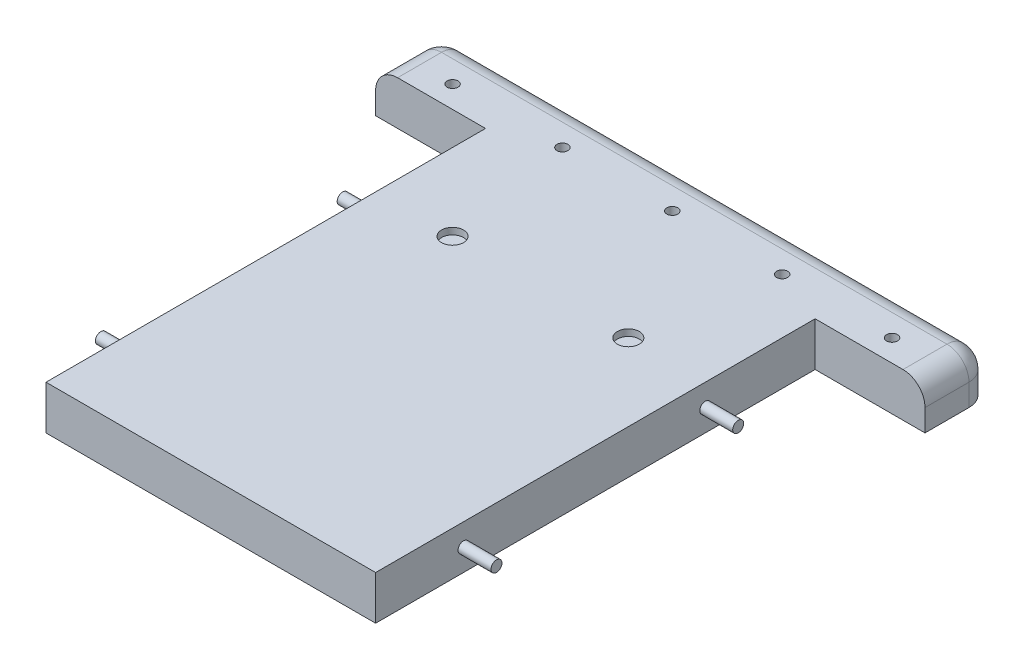
ISO-10303-21;
HEADER;
FILE_DESCRIPTION(('STEP AP214'),'2;1');
FILE_NAME('part.step','',(''),(''),'','','');
FILE_SCHEMA(('AUTOMOTIVE_DESIGN { 1 0 10303 214 1 1 1 1 }'));
ENDSEC;
DATA;
#1=APPLICATION_CONTEXT('core data for automotive mechanical design processes');
#2=APPLICATION_PROTOCOL_DEFINITION('international standard','automotive_design',2000,#1);
#3=PRODUCT_CONTEXT('',#1,'mechanical');
#4=PRODUCT('Part','Part','',(#3));
#5=PRODUCT_RELATED_PRODUCT_CATEGORY('part','',(#4));
#6=PRODUCT_DEFINITION_FORMATION('','',#4);
#7=PRODUCT_DEFINITION_CONTEXT('part definition',#1,'design');
#8=PRODUCT_DEFINITION('design','',#6,#7);
#9=PRODUCT_DEFINITION_SHAPE('','',#8);
#10=(LENGTH_UNIT() NAMED_UNIT(*) SI_UNIT(.MILLI.,.METRE.));
#11=(NAMED_UNIT(*) PLANE_ANGLE_UNIT() SI_UNIT($,.RADIAN.));
#12=(NAMED_UNIT(*) SI_UNIT($,.STERADIAN.) SOLID_ANGLE_UNIT());
#13=UNCERTAINTY_MEASURE_WITH_UNIT(LENGTH_MEASURE(1.E-05),#10,'distance_accuracy_value','');
#14=(GEOMETRIC_REPRESENTATION_CONTEXT(3) GLOBAL_UNCERTAINTY_ASSIGNED_CONTEXT((#13)) GLOBAL_UNIT_ASSIGNED_CONTEXT((#10,
#11,#12)) REPRESENTATION_CONTEXT('',''));
#15=CARTESIAN_POINT('',(0.,0.,0.));
#16=DIRECTION('',(0.,0.,1.));
#17=DIRECTION('',(1.,0.,0.));
#18=AXIS2_PLACEMENT_3D('',#15,#16,#17);
#19=CARTESIAN_POINT('',(-75.,20.,-100.));
#20=DIRECTION('',(1.,0.,0.));
#21=DIRECTION('',(0.,0.,-1.));
#22=AXIS2_PLACEMENT_3D('',#19,#20,#21);
#23=PLANE('',#22);
#24=CARTESIAN_POINT('',(-75.,10.,-50.));
#25=DIRECTION('',(1.,0.,0.));
#26=DIRECTION('',(0.,0.,-1.));
#27=AXIS2_PLACEMENT_3D('',#24,#25,#26);
#28=CIRCLE('',#27,2.49999999999999);
#29=CARTESIAN_POINT('',(-75.,10.,-52.5));
#30=VERTEX_POINT('',#29);
#31=EDGE_CURVE('E213',#30,#30,#28,.T.);
#32=ORIENTED_EDGE('',*,*,#31,.T.);
#33=EDGE_LOOP('',(#32));
#34=FACE_BOUND('',#33,.T.);
#35=CARTESIAN_POINT('',(-75.,10.,60.));
#36=DIRECTION('',(1.,0.,0.));
#37=DIRECTION('',(0.,0.,-1.));
#38=AXIS2_PLACEMENT_3D('',#35,#36,#37);
#39=CIRCLE('',#38,2.49999999999999);
#40=CARTESIAN_POINT('',(-75.,10.,57.5));
#41=VERTEX_POINT('',#40);
#42=EDGE_CURVE('E200',#41,#41,#39,.T.);
#43=ORIENTED_EDGE('',*,*,#42,.T.);
#44=EDGE_LOOP('',(#43));
#45=FACE_BOUND('',#44,.T.);
#46=DIRECTION('',(0.,0.,1.));
#47=VECTOR('',#46,1.);
#48=CARTESIAN_POINT('',(-75.,0.,-100.));
#49=LINE('',#48,#47);
#50=CARTESIAN_POINT('',(-75.,0.,-100.));
#51=VERTEX_POINT('',#50);
#52=CARTESIAN_POINT('',(-75.,0.,100.));
#53=VERTEX_POINT('',#52);
#54=EDGE_CURVE('E150',#51,#53,#49,.T.);
#55=ORIENTED_EDGE('',*,*,#54,.T.);
#56=DIRECTION('',(0.,-1.,0.));
#57=VECTOR('',#56,1.);
#58=CARTESIAN_POINT('',(-75.,20.,100.));
#59=LINE('',#58,#57);
#60=CARTESIAN_POINT('',(-75.,20.,100.));
#61=VERTEX_POINT('',#60);
#62=EDGE_CURVE('E130',#61,#53,#59,.T.);
#63=ORIENTED_EDGE('',*,*,#62,.F.);
#64=DIRECTION('',(0.,0.,1.));
#65=VECTOR('',#64,1.);
#66=CARTESIAN_POINT('',(-75.,20.,-100.));
#67=LINE('',#66,#65);
#68=CARTESIAN_POINT('',(-75.,20.,-100.));
#69=VERTEX_POINT('',#68);
#70=EDGE_CURVE('E137',#69,#61,#67,.T.);
#71=ORIENTED_EDGE('',*,*,#70,.F.);
#72=DIRECTION('',(0.,-1.,0.));
#73=VECTOR('',#72,1.);
#74=CARTESIAN_POINT('',(-75.,20.,-100.));
#75=LINE('',#74,#73);
#76=EDGE_CURVE('E290',#69,#51,#75,.T.);
#77=ORIENTED_EDGE('',*,*,#76,.T.);
#78=EDGE_LOOP('',(#55,#63,#71,#77));
#79=FACE_BOUND('',#78,.T.);
#80=ADVANCED_FACE('F35',(#34,#45,#79),#23,.F.);
#81=CARTESIAN_POINT('',(-75.,20.,100.));
#82=DIRECTION('',(0.,0.,-1.));
#83=DIRECTION('',(-1.,0.,0.));
#84=AXIS2_PLACEMENT_3D('',#81,#82,#83);
#85=PLANE('',#84);
#86=DIRECTION('',(1.,0.,0.));
#87=VECTOR('',#86,1.);
#88=CARTESIAN_POINT('',(-75.,0.,100.));
#89=LINE('',#88,#87);
#90=CARTESIAN_POINT('',(75.,0.,100.));
#91=VERTEX_POINT('',#90);
#92=EDGE_CURVE('E292',#53,#91,#89,.T.);
#93=ORIENTED_EDGE('',*,*,#92,.T.);
#94=DIRECTION('',(0.,-1.,0.));
#95=VECTOR('',#94,1.);
#96=CARTESIAN_POINT('',(75.,20.,100.));
#97=LINE('',#96,#95);
#98=CARTESIAN_POINT('',(75.,20.,100.));
#99=VERTEX_POINT('',#98);
#100=EDGE_CURVE('E133',#99,#91,#97,.T.);
#101=ORIENTED_EDGE('',*,*,#100,.F.);
#102=DIRECTION('',(1.,0.,0.));
#103=VECTOR('',#102,1.);
#104=CARTESIAN_POINT('',(-75.,20.,100.));
#105=LINE('',#104,#103);
#106=EDGE_CURVE('E126',#61,#99,#105,.T.);
#107=ORIENTED_EDGE('',*,*,#106,.F.);
#108=ORIENTED_EDGE('',*,*,#62,.T.);
#109=EDGE_LOOP('',(#93,#101,#107,#108));
#110=FACE_BOUND('',#109,.T.);
#111=ADVANCED_FACE('F128',(#110),#85,.F.);
#112=CARTESIAN_POINT('',(75.,20.,100.));
#113=DIRECTION('',(-1.,0.,0.));
#114=DIRECTION('',(0.,0.,1.));
#115=AXIS2_PLACEMENT_3D('',#112,#113,#114);
#116=PLANE('',#115);
#117=CARTESIAN_POINT('',(75.,10.,-50.));
#118=DIRECTION('',(-1.,0.,0.));
#119=DIRECTION('',(0.,0.,1.));
#120=AXIS2_PLACEMENT_3D('',#117,#118,#119);
#121=CIRCLE('',#120,2.49999999999999);
#122=CARTESIAN_POINT('',(75.,10.,-47.5));
#123=VERTEX_POINT('',#122);
#124=EDGE_CURVE('E39',#123,#123,#121,.T.);
#125=ORIENTED_EDGE('',*,*,#124,.T.);
#126=EDGE_LOOP('',(#125));
#127=FACE_BOUND('',#126,.T.);
#128=CARTESIAN_POINT('',(75.,10.,60.));
#129=DIRECTION('',(-1.,0.,0.));
#130=DIRECTION('',(0.,0.,1.));
#131=AXIS2_PLACEMENT_3D('',#128,#129,#130);
#132=CIRCLE('',#131,2.49999999999999);
#133=CARTESIAN_POINT('',(75.,10.,62.5));
#134=VERTEX_POINT('',#133);
#135=EDGE_CURVE('E198',#134,#134,#132,.T.);
#136=ORIENTED_EDGE('',*,*,#135,.T.);
#137=EDGE_LOOP('',(#136));
#138=FACE_BOUND('',#137,.T.);
#139=DIRECTION('',(0.,0.,-1.));
#140=VECTOR('',#139,1.);
#141=CARTESIAN_POINT('',(75.,0.,100.));
#142=LINE('',#141,#140);
#143=CARTESIAN_POINT('',(75.,0.,-100.));
#144=VERTEX_POINT('',#143);
#145=EDGE_CURVE('E294',#91,#144,#142,.T.);
#146=ORIENTED_EDGE('',*,*,#145,.T.);
#147=DIRECTION('',(0.,-1.,0.));
#148=VECTOR('',#147,1.);
#149=CARTESIAN_POINT('',(75.,20.,-100.));
#150=LINE('',#149,#148);
#151=CARTESIAN_POINT('',(75.,20.,-100.));
#152=VERTEX_POINT('',#151);
#153=EDGE_CURVE('E155',#152,#144,#150,.T.);
#154=ORIENTED_EDGE('',*,*,#153,.F.);
#155=DIRECTION('',(0.,0.,-1.));
#156=VECTOR('',#155,1.);
#157=CARTESIAN_POINT('',(75.,20.,100.));
#158=LINE('',#157,#156);
#159=EDGE_CURVE('E136',#99,#152,#158,.T.);
#160=ORIENTED_EDGE('',*,*,#159,.F.);
#161=ORIENTED_EDGE('',*,*,#100,.T.);
#162=EDGE_LOOP('',(#146,#154,#160,#161));
#163=FACE_BOUND('',#162,.T.);
#164=ADVANCED_FACE('F344',(#127,#138,#163),#116,.F.);
#165=CARTESIAN_POINT('',(75.,20.,-100.));
#166=DIRECTION('',(0.,0.,-1.));
#167=DIRECTION('',(-1.,0.,0.));
#168=AXIS2_PLACEMENT_3D('',#165,#166,#167);
#169=PLANE('',#168);
#170=DIRECTION('',(0.,-1.,0.));
#171=VECTOR('',#170,1.);
#172=CARTESIAN_POINT('',(125.,20.,-100.));
#173=LINE('',#172,#171);
#174=CARTESIAN_POINT('',(125.,10.,-100.));
#175=VERTEX_POINT('',#174);
#176=CARTESIAN_POINT('',(125.,0.,-100.));
#177=VERTEX_POINT('',#176);
#178=EDGE_CURVE('E312',#175,#177,#173,.T.);
#179=ORIENTED_EDGE('',*,*,#178,.F.);
#180=CARTESIAN_POINT('',(115.,10.,-100.));
#181=DIRECTION('',(0.,0.,-1.));
#182=DIRECTION('',(-1.,0.,0.));
#183=AXIS2_PLACEMENT_3D('',#180,#181,#182);
#184=CIRCLE('',#183,10.);
#185=CARTESIAN_POINT('',(115.,20.,-100.));
#186=VERTEX_POINT('',#185);
#187=EDGE_CURVE('E178',#175,#186,#184,.F.);
#188=ORIENTED_EDGE('',*,*,#187,.T.);
#189=DIRECTION('',(1.,0.,0.));
#190=VECTOR('',#189,1.);
#191=CARTESIAN_POINT('',(75.,20.,-100.));
#192=LINE('',#191,#190);
#193=EDGE_CURVE('E287',#152,#186,#192,.T.);
#194=ORIENTED_EDGE('',*,*,#193,.F.);
#195=ORIENTED_EDGE('',*,*,#153,.T.);
#196=DIRECTION('',(1.,0.,0.));
#197=VECTOR('',#196,1.);
#198=CARTESIAN_POINT('',(75.,0.,-100.));
#199=LINE('',#198,#197);
#200=EDGE_CURVE('E296',#144,#177,#199,.T.);
#201=ORIENTED_EDGE('',*,*,#200,.T.);
#202=EDGE_LOOP('',(#179,#188,#194,#195,#201));
#203=FACE_BOUND('',#202,.T.);
#204=ADVANCED_FACE('F319',(#203),#169,.F.);
#205=CARTESIAN_POINT('',(125.,20.,-100.));
#206=DIRECTION('',(-1.,0.,0.));
#207=DIRECTION('',(0.,0.,1.));
#208=AXIS2_PLACEMENT_3D('',#205,#206,#207);
#209=PLANE('',#208);
#210=DIRECTION('',(0.,-1.,0.));
#211=VECTOR('',#210,1.);
#212=CARTESIAN_POINT('',(125.,20.,-120.));
#213=LINE('',#212,#211);
#214=CARTESIAN_POINT('',(125.,0.,-120.));
#215=VERTEX_POINT('',#214);
#216=CARTESIAN_POINT('',(125.,10.,-120.));
#217=VERTEX_POINT('',#216);
#218=EDGE_CURVE('E164',#215,#217,#213,.F.);
#219=ORIENTED_EDGE('',*,*,#218,.T.);
#220=DIRECTION('',(0.,0.,-1.));
#221=VECTOR('',#220,1.);
#222=CARTESIAN_POINT('',(125.,10.,-100.));
#223=LINE('',#222,#221);
#224=EDGE_CURVE('E176',#217,#175,#223,.F.);
#225=ORIENTED_EDGE('',*,*,#224,.T.);
#226=ORIENTED_EDGE('',*,*,#178,.T.);
#227=DIRECTION('',(0.,0.,-1.));
#228=VECTOR('',#227,1.);
#229=CARTESIAN_POINT('',(125.,0.,-100.));
#230=LINE('',#229,#228);
#231=EDGE_CURVE('E299',#177,#215,#230,.T.);
#232=ORIENTED_EDGE('',*,*,#231,.T.);
#233=EDGE_LOOP('',(#219,#225,#226,#232));
#234=FACE_BOUND('',#233,.T.);
#235=ADVANCED_FACE('F329',(#234),#209,.F.);
#236=CARTESIAN_POINT('',(125.,20.,-130.));
#237=DIRECTION('',(0.,0.,1.));
#238=DIRECTION('',(1.,0.,0.));
#239=AXIS2_PLACEMENT_3D('',#236,#237,#238);
#240=PLANE('',#239);
#241=DIRECTION('',(0.,-1.,0.));
#242=VECTOR('',#241,1.);
#243=CARTESIAN_POINT('',(-115.,20.,-130.));
#244=LINE('',#243,#242);
#245=CARTESIAN_POINT('',(-115.,0.,-130.));
#246=VERTEX_POINT('',#245);
#247=CARTESIAN_POINT('',(-115.,10.,-130.));
#248=VERTEX_POINT('',#247);
#249=EDGE_CURVE('E151',#246,#248,#244,.F.);
#250=ORIENTED_EDGE('',*,*,#249,.T.);
#251=DIRECTION('',(-1.,0.,0.));
#252=VECTOR('',#251,1.);
#253=CARTESIAN_POINT('',(115.,10.,-130.));
#254=LINE('',#253,#252);
#255=CARTESIAN_POINT('',(115.,10.,-130.));
#256=VERTEX_POINT('',#255);
#257=EDGE_CURVE('E11',#248,#256,#254,.F.);
#258=ORIENTED_EDGE('',*,*,#257,.T.);
#259=DIRECTION('',(0.,-1.,0.));
#260=VECTOR('',#259,1.);
#261=CARTESIAN_POINT('',(115.,20.,-130.));
#262=LINE('',#261,#260);
#263=CARTESIAN_POINT('',(115.,0.,-130.));
#264=VERTEX_POINT('',#263);
#265=EDGE_CURVE('E153',#256,#264,#262,.T.);
#266=ORIENTED_EDGE('',*,*,#265,.T.);
#267=DIRECTION('',(-1.,0.,0.));
#268=VECTOR('',#267,1.);
#269=CARTESIAN_POINT('',(125.,0.,-130.));
#270=LINE('',#269,#268);
#271=EDGE_CURVE('E302',#264,#246,#270,.T.);
#272=ORIENTED_EDGE('',*,*,#271,.T.);
#273=EDGE_LOOP('',(#250,#258,#266,#272));
#274=FACE_BOUND('',#273,.T.);
#275=ADVANCED_FACE('F388',(#274),#240,.F.);
#276=CARTESIAN_POINT('',(-125.,20.,-130.));
#277=DIRECTION('',(1.,0.,0.));
#278=DIRECTION('',(0.,0.,-1.));
#279=AXIS2_PLACEMENT_3D('',#276,#277,#278);
#280=PLANE('',#279);
#281=DIRECTION('',(0.,-1.,0.));
#282=VECTOR('',#281,1.);
#283=CARTESIAN_POINT('',(-125.,20.,-100.));
#284=LINE('',#283,#282);
#285=CARTESIAN_POINT('',(-125.,10.,-100.));
#286=VERTEX_POINT('',#285);
#287=CARTESIAN_POINT('',(-125.,0.,-100.));
#288=VERTEX_POINT('',#287);
#289=EDGE_CURVE('E310',#286,#288,#284,.T.);
#290=ORIENTED_EDGE('',*,*,#289,.F.);
#291=DIRECTION('',(0.,0.,1.));
#292=VECTOR('',#291,1.);
#293=CARTESIAN_POINT('',(-125.,10.,-120.));
#294=LINE('',#293,#292);
#295=CARTESIAN_POINT('',(-125.,10.,-120.));
#296=VERTEX_POINT('',#295);
#297=EDGE_CURVE('E59',#286,#296,#294,.F.);
#298=ORIENTED_EDGE('',*,*,#297,.T.);
#299=DIRECTION('',(0.,-1.,0.));
#300=VECTOR('',#299,1.);
#301=CARTESIAN_POINT('',(-125.,20.,-120.));
#302=LINE('',#301,#300);
#303=CARTESIAN_POINT('',(-125.,0.,-120.));
#304=VERTEX_POINT('',#303);
#305=EDGE_CURVE('E167',#296,#304,#302,.T.);
#306=ORIENTED_EDGE('',*,*,#305,.T.);
#307=DIRECTION('',(0.,0.,1.));
#308=VECTOR('',#307,1.);
#309=CARTESIAN_POINT('',(-125.,0.,-130.));
#310=LINE('',#309,#308);
#311=EDGE_CURVE('E305',#304,#288,#310,.T.);
#312=ORIENTED_EDGE('',*,*,#311,.T.);
#313=EDGE_LOOP('',(#290,#298,#306,#312));
#314=FACE_BOUND('',#313,.T.);
#315=ADVANCED_FACE('F392',(#314),#280,.F.);
#316=CARTESIAN_POINT('',(-125.,20.,-100.));
#317=DIRECTION('',(0.,0.,-1.));
#318=DIRECTION('',(-1.,0.,0.));
#319=AXIS2_PLACEMENT_3D('',#316,#317,#318);
#320=PLANE('',#319);
#321=DIRECTION('',(1.,0.,0.));
#322=VECTOR('',#321,1.);
#323=CARTESIAN_POINT('',(-125.,20.,-100.));
#324=LINE('',#323,#322);
#325=CARTESIAN_POINT('',(-115.,20.,-100.));
#326=VERTEX_POINT('',#325);
#327=EDGE_CURVE('E143',#326,#69,#324,.T.);
#328=ORIENTED_EDGE('',*,*,#327,.F.);
#329=CARTESIAN_POINT('',(-115.,10.,-100.));
#330=DIRECTION('',(0.,0.,-1.));
#331=DIRECTION('',(-1.,0.,0.));
#332=AXIS2_PLACEMENT_3D('',#329,#330,#331);
#333=CIRCLE('',#332,10.);
#334=EDGE_CURVE('E182',#326,#286,#333,.F.);
#335=ORIENTED_EDGE('',*,*,#334,.T.);
#336=ORIENTED_EDGE('',*,*,#289,.T.);
#337=DIRECTION('',(1.,0.,0.));
#338=VECTOR('',#337,1.);
#339=CARTESIAN_POINT('',(-125.,0.,-100.));
#340=LINE('',#339,#338);
#341=EDGE_CURVE('E147',#288,#51,#340,.T.);
#342=ORIENTED_EDGE('',*,*,#341,.T.);
#343=ORIENTED_EDGE('',*,*,#76,.F.);
#344=EDGE_LOOP('',(#328,#335,#336,#342,#343));
#345=FACE_BOUND('',#344,.T.);
#346=ADVANCED_FACE('F396',(#345),#320,.F.);
#347=CARTESIAN_POINT('',(0.,20.,0.));
#348=DIRECTION('',(0.,1.,0.));
#349=DIRECTION('',(0.,0.,1.));
#350=AXIS2_PLACEMENT_3D('',#347,#348,#349);
#351=PLANE('',#350);
#352=CARTESIAN_POINT('',(-40.,20.,-50.));
#353=DIRECTION('',(0.,1.,0.));
#354=DIRECTION('',(0.,0.,1.));
#355=AXIS2_PLACEMENT_3D('',#352,#353,#354);
#356=CIRCLE('',#355,5.);
#357=CARTESIAN_POINT('',(-40.,20.,-45.));
#358=VERTEX_POINT('',#357);
#359=EDGE_CURVE('E221',#358,#358,#356,.T.);
#360=ORIENTED_EDGE('',*,*,#359,.F.);
#361=EDGE_LOOP('',(#360));
#362=FACE_BOUND('',#361,.T.);
#363=CARTESIAN_POINT('',(40.,20.,-50.));
#364=DIRECTION('',(0.,1.,0.));
#365=DIRECTION('',(0.,0.,-1.));
#366=AXIS2_PLACEMENT_3D('',#363,#364,#365);
#367=CIRCLE('',#366,5.);
#368=CARTESIAN_POINT('',(40.,20.,-55.));
#369=VERTEX_POINT('',#368);
#370=EDGE_CURVE('E205',#369,#369,#367,.T.);
#371=ORIENTED_EDGE('',*,*,#370,.F.);
#372=EDGE_LOOP('',(#371));
#373=FACE_BOUND('',#372,.T.);
#374=CARTESIAN_POINT('',(-100.,20.,-110.));
#375=DIRECTION('',(0.,1.,0.));
#376=DIRECTION('',(0.,0.,-1.));
#377=AXIS2_PLACEMENT_3D('',#374,#375,#376);
#378=CIRCLE('',#377,2.50000000000001);
#379=CARTESIAN_POINT('',(-100.,20.,-112.5));
#380=VERTEX_POINT('',#379);
#381=EDGE_CURVE('E220',#380,#380,#378,.T.);
#382=ORIENTED_EDGE('',*,*,#381,.F.);
#383=EDGE_LOOP('',(#382));
#384=FACE_BOUND('',#383,.T.);
#385=CARTESIAN_POINT('',(-50.,20.,-110.));
#386=DIRECTION('',(0.,1.,0.));
#387=DIRECTION('',(0.,0.,-1.));
#388=AXIS2_PLACEMENT_3D('',#385,#386,#387);
#389=CIRCLE('',#388,2.5);
#390=CARTESIAN_POINT('',(-50.,20.,-112.5));
#391=VERTEX_POINT('',#390);
#392=EDGE_CURVE('E245',#391,#391,#389,.T.);
#393=ORIENTED_EDGE('',*,*,#392,.F.);
#394=EDGE_LOOP('',(#393));
#395=FACE_BOUND('',#394,.T.);
#396=CARTESIAN_POINT('',(100.,20.,-110.));
#397=DIRECTION('',(0.,1.,0.));
#398=DIRECTION('',(0.,0.,1.));
#399=AXIS2_PLACEMENT_3D('',#396,#397,#398);
#400=CIRCLE('',#399,2.50000000000001);
#401=CARTESIAN_POINT('',(100.,20.,-107.5));
#402=VERTEX_POINT('',#401);
#403=EDGE_CURVE('E239',#402,#402,#400,.T.);
#404=ORIENTED_EDGE('',*,*,#403,.F.);
#405=EDGE_LOOP('',(#404));
#406=FACE_BOUND('',#405,.T.);
#407=CARTESIAN_POINT('',(50.,20.,-110.));
#408=DIRECTION('',(0.,1.,0.));
#409=DIRECTION('',(0.,0.,1.));
#410=AXIS2_PLACEMENT_3D('',#407,#408,#409);
#411=CIRCLE('',#410,2.5);
#412=CARTESIAN_POINT('',(50.,20.,-107.5));
#413=VERTEX_POINT('',#412);
#414=EDGE_CURVE('E233',#413,#413,#411,.T.);
#415=ORIENTED_EDGE('',*,*,#414,.F.);
#416=EDGE_LOOP('',(#415));
#417=FACE_BOUND('',#416,.T.);
#418=CARTESIAN_POINT('',(0.,20.,-110.));
#419=DIRECTION('',(0.,1.,0.));
#420=DIRECTION('',(0.,0.,1.));
#421=AXIS2_PLACEMENT_3D('',#418,#419,#420);
#422=CIRCLE('',#421,2.5);
#423=CARTESIAN_POINT('',(0.,20.,-107.5));
#424=VERTEX_POINT('',#423);
#425=EDGE_CURVE('E232',#424,#424,#422,.T.);
#426=ORIENTED_EDGE('',*,*,#425,.F.);
#427=EDGE_LOOP('',(#426));
#428=FACE_BOUND('',#427,.T.);
#429=ORIENTED_EDGE('',*,*,#193,.T.);
#430=DIRECTION('',(0.,0.,-1.));
#431=VECTOR('',#430,1.);
#432=CARTESIAN_POINT('',(115.,20.,-120.));
#433=LINE('',#432,#431);
#434=CARTESIAN_POINT('',(115.,20.,-120.));
#435=VERTEX_POINT('',#434);
#436=EDGE_CURVE('E173',#186,#435,#433,.T.);
#437=ORIENTED_EDGE('',*,*,#436,.T.);
#438=DIRECTION('',(-1.,0.,0.));
#439=VECTOR('',#438,1.);
#440=CARTESIAN_POINT('',(-115.,20.,-120.));
#441=LINE('',#440,#439);
#442=CARTESIAN_POINT('',(-115.,20.,-120.));
#443=VERTEX_POINT('',#442);
#444=EDGE_CURVE('E169',#435,#443,#441,.T.);
#445=ORIENTED_EDGE('',*,*,#444,.T.);
#446=DIRECTION('',(0.,0.,1.));
#447=VECTOR('',#446,1.);
#448=CARTESIAN_POINT('',(-115.,20.,-100.));
#449=LINE('',#448,#447);
#450=EDGE_CURVE('E171',#443,#326,#449,.T.);
#451=ORIENTED_EDGE('',*,*,#450,.T.);
#452=ORIENTED_EDGE('',*,*,#327,.T.);
#453=ORIENTED_EDGE('',*,*,#70,.T.);
#454=ORIENTED_EDGE('',*,*,#106,.T.);
#455=ORIENTED_EDGE('',*,*,#159,.T.);
#456=EDGE_LOOP('',(#429,#437,#445,#451,#452,#453,#454,#455));
#457=FACE_BOUND('',#456,.T.);
#458=ADVANCED_FACE('F141',(#362,#373,#384,#395,#406,#417,#428,#457),#351,.T.);
#459=CARTESIAN_POINT('',(0.,0.,0.));
#460=DIRECTION('',(0.,1.,0.));
#461=DIRECTION('',(0.,0.,1.));
#462=AXIS2_PLACEMENT_3D('',#459,#460,#461);
#463=PLANE('',#462);
#464=CARTESIAN_POINT('',(-100.,0.,-115.));
#465=DIRECTION('',(0.,-1.,0.));
#466=DIRECTION('',(0.,0.,-1.));
#467=AXIS2_PLACEMENT_3D('',#464,#465,#466);
#468=CIRCLE('',#467,2.5);
#469=CARTESIAN_POINT('',(-100.,0.,-117.5));
#470=VERTEX_POINT('',#469);
#471=EDGE_CURVE('E260',#470,#470,#468,.T.);
#472=ORIENTED_EDGE('',*,*,#471,.F.);
#473=EDGE_LOOP('',(#472));
#474=FACE_BOUND('',#473,.T.);
#475=CARTESIAN_POINT('',(-50.,0.,-115.));
#476=DIRECTION('',(0.,-1.,0.));
#477=DIRECTION('',(0.,0.,-1.));
#478=AXIS2_PLACEMENT_3D('',#475,#476,#477);
#479=CIRCLE('',#478,2.5);
#480=CARTESIAN_POINT('',(-50.,0.,-117.5));
#481=VERTEX_POINT('',#480);
#482=EDGE_CURVE('E266',#481,#481,#479,.T.);
#483=ORIENTED_EDGE('',*,*,#482,.F.);
#484=EDGE_LOOP('',(#483));
#485=FACE_BOUND('',#484,.T.);
#486=CARTESIAN_POINT('',(0.,0.,-115.));
#487=DIRECTION('',(0.,-1.,0.));
#488=DIRECTION('',(0.,0.,-1.));
#489=AXIS2_PLACEMENT_3D('',#486,#487,#488);
#490=CIRCLE('',#489,2.5);
#491=CARTESIAN_POINT('',(0.,0.,-117.5));
#492=VERTEX_POINT('',#491);
#493=EDGE_CURVE('E272',#492,#492,#490,.T.);
#494=ORIENTED_EDGE('',*,*,#493,.F.);
#495=EDGE_LOOP('',(#494));
#496=FACE_BOUND('',#495,.T.);
#497=CARTESIAN_POINT('',(50.,0.,-115.));
#498=DIRECTION('',(0.,-1.,0.));
#499=DIRECTION('',(0.,0.,1.));
#500=AXIS2_PLACEMENT_3D('',#497,#498,#499);
#501=CIRCLE('',#500,2.5);
#502=CARTESIAN_POINT('',(50.,0.,-112.5));
#503=VERTEX_POINT('',#502);
#504=EDGE_CURVE('E278',#503,#503,#501,.T.);
#505=ORIENTED_EDGE('',*,*,#504,.F.);
#506=EDGE_LOOP('',(#505));
#507=FACE_BOUND('',#506,.T.);
#508=CARTESIAN_POINT('',(100.,0.,-115.));
#509=DIRECTION('',(0.,-1.,0.));
#510=DIRECTION('',(0.,0.,1.));
#511=AXIS2_PLACEMENT_3D('',#508,#509,#510);
#512=CIRCLE('',#511,2.5);
#513=CARTESIAN_POINT('',(100.,0.,-112.5));
#514=VERTEX_POINT('',#513);
#515=EDGE_CURVE('E197',#514,#514,#512,.T.);
#516=ORIENTED_EDGE('',*,*,#515,.F.);
#517=EDGE_LOOP('',(#516));
#518=FACE_BOUND('',#517,.T.);
#519=ORIENTED_EDGE('',*,*,#271,.F.);
#520=CARTESIAN_POINT('',(115.,0.,-120.));
#521=DIRECTION('',(0.,1.,0.));
#522=DIRECTION('',(0.,0.,1.));
#523=AXIS2_PLACEMENT_3D('',#520,#521,#522);
#524=CIRCLE('',#523,10.);
#525=EDGE_CURVE('E162',#264,#215,#524,.F.);
#526=ORIENTED_EDGE('',*,*,#525,.T.);
#527=ORIENTED_EDGE('',*,*,#231,.F.);
#528=ORIENTED_EDGE('',*,*,#200,.F.);
#529=ORIENTED_EDGE('',*,*,#145,.F.);
#530=ORIENTED_EDGE('',*,*,#92,.F.);
#531=ORIENTED_EDGE('',*,*,#54,.F.);
#532=ORIENTED_EDGE('',*,*,#341,.F.);
#533=ORIENTED_EDGE('',*,*,#311,.F.);
#534=CARTESIAN_POINT('',(-115.,0.,-120.));
#535=DIRECTION('',(0.,1.,0.));
#536=DIRECTION('',(0.,0.,1.));
#537=AXIS2_PLACEMENT_3D('',#534,#535,#536);
#538=CIRCLE('',#537,10.);
#539=EDGE_CURVE('E160',#304,#246,#538,.F.);
#540=ORIENTED_EDGE('',*,*,#539,.T.);
#541=EDGE_LOOP('',(#519,#526,#527,#528,#529,#530,#531,#532,#533,#540));
#542=FACE_BOUND('',#541,.T.);
#543=ADVANCED_FACE('F325',(#474,#485,#496,#507,#518,#542),#463,.F.);
#544=CARTESIAN_POINT('',(100.,5.,-115.));
#545=DIRECTION('',(0.,-1.,0.));
#546=DIRECTION('',(0.,0.,-1.));
#547=AXIS2_PLACEMENT_3D('',#544,#545,#546);
#548=CYLINDRICAL_SURFACE('',#547,2.5);
#549=CARTESIAN_POINT('',(100.,5.,-115.));
#550=DIRECTION('',(0.,-1.,0.));
#551=DIRECTION('',(0.,0.,1.));
#552=AXIS2_PLACEMENT_3D('',#549,#550,#551);
#553=CIRCLE('',#552,2.5);
#554=CARTESIAN_POINT('',(100.,5.,-112.5));
#555=VERTEX_POINT('',#554);
#556=EDGE_CURVE('E281',#555,#555,#553,.T.);
#557=ORIENTED_EDGE('',*,*,#556,.F.);
#558=EDGE_LOOP('',(#557));
#559=FACE_BOUND('',#558,.T.);
#560=ORIENTED_EDGE('',*,*,#515,.T.);
#561=EDGE_LOOP('',(#560));
#562=FACE_BOUND('',#561,.T.);
#563=ADVANCED_FACE('F744',(#559,#562),#548,.F.);
#564=CARTESIAN_POINT('',(100.,5.,-115.));
#565=DIRECTION('',(0.,1.,0.));
#566=DIRECTION('',(0.,0.,1.));
#567=AXIS2_PLACEMENT_3D('',#564,#565,#566);
#568=PLANE('',#567);
#569=ORIENTED_EDGE('',*,*,#556,.T.);
#570=EDGE_LOOP('',(#569));
#571=FACE_BOUND('',#570,.T.);
#572=ADVANCED_FACE('F740',(#571),#568,.F.);
#573=CARTESIAN_POINT('',(50.,5.,-115.));
#574=DIRECTION('',(0.,-1.,0.));
#575=DIRECTION('',(0.,0.,-1.));
#576=AXIS2_PLACEMENT_3D('',#573,#574,#575);
#577=CYLINDRICAL_SURFACE('',#576,2.5);
#578=CARTESIAN_POINT('',(50.,5.,-115.));
#579=DIRECTION('',(0.,-1.,0.));
#580=DIRECTION('',(0.,0.,1.));
#581=AXIS2_PLACEMENT_3D('',#578,#579,#580);
#582=CIRCLE('',#581,2.5);
#583=CARTESIAN_POINT('',(50.,5.,-112.5));
#584=VERTEX_POINT('',#583);
#585=EDGE_CURVE('E275',#584,#584,#582,.T.);
#586=ORIENTED_EDGE('',*,*,#585,.F.);
#587=EDGE_LOOP('',(#586));
#588=FACE_BOUND('',#587,.T.);
#589=ORIENTED_EDGE('',*,*,#504,.T.);
#590=EDGE_LOOP('',(#589));
#591=FACE_BOUND('',#590,.T.);
#592=ADVANCED_FACE('F736',(#588,#591),#577,.F.);
#593=CARTESIAN_POINT('',(50.,5.,-115.));
#594=DIRECTION('',(0.,1.,0.));
#595=DIRECTION('',(0.,0.,1.));
#596=AXIS2_PLACEMENT_3D('',#593,#594,#595);
#597=PLANE('',#596);
#598=ORIENTED_EDGE('',*,*,#585,.T.);
#599=EDGE_LOOP('',(#598));
#600=FACE_BOUND('',#599,.T.);
#601=ADVANCED_FACE('F732',(#600),#597,.F.);
#602=CARTESIAN_POINT('',(0.,5.,-115.));
#603=DIRECTION('',(0.,-1.,0.));
#604=DIRECTION('',(0.,0.,-1.));
#605=AXIS2_PLACEMENT_3D('',#602,#603,#604);
#606=CYLINDRICAL_SURFACE('',#605,2.5);
#607=CARTESIAN_POINT('',(0.,5.,-115.));
#608=DIRECTION('',(0.,-1.,0.));
#609=DIRECTION('',(0.,0.,-1.));
#610=AXIS2_PLACEMENT_3D('',#607,#608,#609);
#611=CIRCLE('',#610,2.5);
#612=CARTESIAN_POINT('',(0.,5.,-117.5));
#613=VERTEX_POINT('',#612);
#614=EDGE_CURVE('E269',#613,#613,#611,.T.);
#615=ORIENTED_EDGE('',*,*,#614,.F.);
#616=EDGE_LOOP('',(#615));
#617=FACE_BOUND('',#616,.T.);
#618=ORIENTED_EDGE('',*,*,#493,.T.);
#619=EDGE_LOOP('',(#618));
#620=FACE_BOUND('',#619,.T.);
#621=ADVANCED_FACE('F728',(#617,#620),#606,.F.);
#622=CARTESIAN_POINT('',(0.,5.,-115.));
#623=DIRECTION('',(0.,-1.,0.));
#624=DIRECTION('',(0.,0.,-1.));
#625=AXIS2_PLACEMENT_3D('',#622,#623,#624);
#626=PLANE('',#625);
#627=ORIENTED_EDGE('',*,*,#614,.T.);
#628=EDGE_LOOP('',(#627));
#629=FACE_BOUND('',#628,.T.);
#630=ADVANCED_FACE('F724',(#629),#626,.T.);
#631=CARTESIAN_POINT('',(-50.,5.,-115.));
#632=DIRECTION('',(0.,-1.,0.));
#633=DIRECTION('',(0.,0.,-1.));
#634=AXIS2_PLACEMENT_3D('',#631,#632,#633);
#635=CYLINDRICAL_SURFACE('',#634,2.5);
#636=CARTESIAN_POINT('',(-50.,5.,-115.));
#637=DIRECTION('',(0.,-1.,0.));
#638=DIRECTION('',(0.,0.,-1.));
#639=AXIS2_PLACEMENT_3D('',#636,#637,#638);
#640=CIRCLE('',#639,2.5);
#641=CARTESIAN_POINT('',(-50.,5.,-117.5));
#642=VERTEX_POINT('',#641);
#643=EDGE_CURVE('E263',#642,#642,#640,.T.);
#644=ORIENTED_EDGE('',*,*,#643,.F.);
#645=EDGE_LOOP('',(#644));
#646=FACE_BOUND('',#645,.T.);
#647=ORIENTED_EDGE('',*,*,#482,.T.);
#648=EDGE_LOOP('',(#647));
#649=FACE_BOUND('',#648,.T.);
#650=ADVANCED_FACE('F720',(#646,#649),#635,.F.);
#651=CARTESIAN_POINT('',(-50.,5.,-115.));
#652=DIRECTION('',(0.,-1.,0.));
#653=DIRECTION('',(0.,0.,-1.));
#654=AXIS2_PLACEMENT_3D('',#651,#652,#653);
#655=PLANE('',#654);
#656=ORIENTED_EDGE('',*,*,#643,.T.);
#657=EDGE_LOOP('',(#656));
#658=FACE_BOUND('',#657,.T.);
#659=ADVANCED_FACE('F716',(#658),#655,.T.);
#660=CARTESIAN_POINT('',(-100.,5.,-115.));
#661=DIRECTION('',(0.,-1.,0.));
#662=DIRECTION('',(0.,0.,-1.));
#663=AXIS2_PLACEMENT_3D('',#660,#661,#662);
#664=CYLINDRICAL_SURFACE('',#663,2.5);
#665=CARTESIAN_POINT('',(-100.,5.,-115.));
#666=DIRECTION('',(0.,-1.,0.));
#667=DIRECTION('',(0.,0.,-1.));
#668=AXIS2_PLACEMENT_3D('',#665,#666,#667);
#669=CIRCLE('',#668,2.5);
#670=CARTESIAN_POINT('',(-100.,5.,-117.5));
#671=VERTEX_POINT('',#670);
#672=EDGE_CURVE('E257',#671,#671,#669,.T.);
#673=ORIENTED_EDGE('',*,*,#672,.F.);
#674=EDGE_LOOP('',(#673));
#675=FACE_BOUND('',#674,.T.);
#676=ORIENTED_EDGE('',*,*,#471,.T.);
#677=EDGE_LOOP('',(#676));
#678=FACE_BOUND('',#677,.T.);
#679=ADVANCED_FACE('F712',(#675,#678),#664,.F.);
#680=CARTESIAN_POINT('',(-100.,5.,-115.));
#681=DIRECTION('',(0.,-1.,0.));
#682=DIRECTION('',(0.,0.,-1.));
#683=AXIS2_PLACEMENT_3D('',#680,#681,#682);
#684=PLANE('',#683);
#685=ORIENTED_EDGE('',*,*,#672,.T.);
#686=EDGE_LOOP('',(#685));
#687=FACE_BOUND('',#686,.T.);
#688=ADVANCED_FACE('F366',(#687),#684,.T.);
#689=CARTESIAN_POINT('',(115.,20.,-120.));
#690=DIRECTION('',(0.,-1.,0.));
#691=DIRECTION('',(0.,0.,-1.));
#692=AXIS2_PLACEMENT_3D('',#689,#690,#691);
#693=CYLINDRICAL_SURFACE('',#692,10.);
#694=ORIENTED_EDGE('',*,*,#265,.F.);
#695=CARTESIAN_POINT('',(115.,10.,-120.));
#696=DIRECTION('',(0.,-1.,0.));
#697=DIRECTION('',(0.,0.,-1.));
#698=AXIS2_PLACEMENT_3D('',#695,#696,#697);
#699=CIRCLE('',#698,10.);
#700=EDGE_CURVE('E180',#256,#217,#699,.T.);
#701=ORIENTED_EDGE('',*,*,#700,.T.);
#702=ORIENTED_EDGE('',*,*,#218,.F.);
#703=ORIENTED_EDGE('',*,*,#525,.F.);
#704=EDGE_LOOP('',(#694,#701,#702,#703));
#705=FACE_BOUND('',#704,.T.);
#706=ADVANCED_FACE('F333',(#705),#693,.T.);
#707=CARTESIAN_POINT('',(-115.,20.,-120.));
#708=DIRECTION('',(0.,-1.,0.));
#709=DIRECTION('',(0.,0.,-1.));
#710=AXIS2_PLACEMENT_3D('',#707,#708,#709);
#711=CYLINDRICAL_SURFACE('',#710,10.);
#712=ORIENTED_EDGE('',*,*,#305,.F.);
#713=CARTESIAN_POINT('',(-115.,10.,-120.));
#714=DIRECTION('',(0.,-1.,0.));
#715=DIRECTION('',(0.,0.,-1.));
#716=AXIS2_PLACEMENT_3D('',#713,#714,#715);
#717=CIRCLE('',#716,10.);
#718=EDGE_CURVE('E44',#296,#248,#717,.T.);
#719=ORIENTED_EDGE('',*,*,#718,.T.);
#720=ORIENTED_EDGE('',*,*,#249,.F.);
#721=ORIENTED_EDGE('',*,*,#539,.F.);
#722=EDGE_LOOP('',(#712,#719,#720,#721));
#723=FACE_BOUND('',#722,.T.);
#724=ADVANCED_FACE('F365',(#723),#711,.T.);
#725=CARTESIAN_POINT('',(-115.,10.,0.));
#726=DIRECTION('',(0.,0.,-1.));
#727=DIRECTION('',(-1.,0.,0.));
#728=AXIS2_PLACEMENT_3D('',#725,#726,#727);
#729=CYLINDRICAL_SURFACE('',#728,10.);
#730=CARTESIAN_POINT('',(-115.,10.,-120.));
#731=DIRECTION('',(0.,0.,-1.));
#732=DIRECTION('',(-1.,0.,0.));
#733=AXIS2_PLACEMENT_3D('',#730,#731,#732);
#734=CIRCLE('',#733,10.);
#735=EDGE_CURVE('E195',#296,#443,#734,.T.);
#736=ORIENTED_EDGE('',*,*,#735,.F.);
#737=ORIENTED_EDGE('',*,*,#297,.F.);
#738=ORIENTED_EDGE('',*,*,#334,.F.);
#739=ORIENTED_EDGE('',*,*,#450,.F.);
#740=EDGE_LOOP('',(#736,#737,#738,#739));
#741=FACE_BOUND('',#740,.T.);
#742=ADVANCED_FACE('F37',(#741),#729,.T.);
#743=CARTESIAN_POINT('',(-115.,10.,-120.));
#744=DIRECTION('',(0.,1.,0.));
#745=DIRECTION('',(0.,0.,1.));
#746=AXIS2_PLACEMENT_3D('',#743,#744,#745);
#747=SPHERICAL_SURFACE('',#746,10.);
#748=ORIENTED_EDGE('',*,*,#718,.F.);
#749=ORIENTED_EDGE('',*,*,#735,.T.);
#750=CARTESIAN_POINT('',(-115.,10.,-120.));
#751=DIRECTION('',(1.,0.,0.));
#752=DIRECTION('',(0.,0.,-1.));
#753=AXIS2_PLACEMENT_3D('',#750,#751,#752);
#754=CIRCLE('',#753,10.);
#755=EDGE_CURVE('E192',#248,#443,#754,.T.);
#756=ORIENTED_EDGE('',*,*,#755,.F.);
#757=EDGE_LOOP('',(#748,#749,#756));
#758=FACE_BOUND('',#757,.T.);
#759=ADVANCED_FACE('F376',(#758),#747,.T.);
#760=CARTESIAN_POINT('',(0.,10.,-120.));
#761=DIRECTION('',(1.,0.,0.));
#762=DIRECTION('',(0.,0.,-1.));
#763=AXIS2_PLACEMENT_3D('',#760,#761,#762);
#764=CYLINDRICAL_SURFACE('',#763,10.);
#765=CARTESIAN_POINT('',(115.,10.,-120.));
#766=DIRECTION('',(1.,0.,0.));
#767=DIRECTION('',(0.,0.,-1.));
#768=AXIS2_PLACEMENT_3D('',#765,#766,#767);
#769=CIRCLE('',#768,10.);
#770=EDGE_CURVE('E188',#256,#435,#769,.T.);
#771=ORIENTED_EDGE('',*,*,#770,.F.);
#772=ORIENTED_EDGE('',*,*,#257,.F.);
#773=ORIENTED_EDGE('',*,*,#755,.T.);
#774=ORIENTED_EDGE('',*,*,#444,.F.);
#775=EDGE_LOOP('',(#771,#772,#773,#774));
#776=FACE_BOUND('',#775,.T.);
#777=ADVANCED_FACE('F374',(#776),#764,.T.);
#778=CARTESIAN_POINT('',(115.,10.,-120.));
#779=DIRECTION('',(0.,1.,0.));
#780=DIRECTION('',(0.,0.,1.));
#781=AXIS2_PLACEMENT_3D('',#778,#779,#780);
#782=SPHERICAL_SURFACE('',#781,10.);
#783=ORIENTED_EDGE('',*,*,#700,.F.);
#784=ORIENTED_EDGE('',*,*,#770,.T.);
#785=CARTESIAN_POINT('',(115.,10.,-120.));
#786=DIRECTION('',(0.,0.,1.));
#787=DIRECTION('',(1.,0.,0.));
#788=AXIS2_PLACEMENT_3D('',#785,#786,#787);
#789=CIRCLE('',#788,10.);
#790=EDGE_CURVE('E186',#217,#435,#789,.T.);
#791=ORIENTED_EDGE('',*,*,#790,.F.);
#792=EDGE_LOOP('',(#783,#784,#791));
#793=FACE_BOUND('',#792,.T.);
#794=ADVANCED_FACE('F338',(#793),#782,.T.);
#795=CARTESIAN_POINT('',(115.,10.,1.06396373193244E-13));
#796=DIRECTION('',(0.,0.,1.));
#797=DIRECTION('',(1.,0.,0.));
#798=AXIS2_PLACEMENT_3D('',#795,#796,#797);
#799=CYLINDRICAL_SURFACE('',#798,10.);
#800=ORIENTED_EDGE('',*,*,#187,.F.);
#801=ORIENTED_EDGE('',*,*,#224,.F.);
#802=ORIENTED_EDGE('',*,*,#790,.T.);
#803=ORIENTED_EDGE('',*,*,#436,.F.);
#804=EDGE_LOOP('',(#800,#801,#802,#803));
#805=FACE_BOUND('',#804,.T.);
#806=ADVANCED_FACE('F343',(#805),#799,.T.);
#807=CARTESIAN_POINT('',(0.,15.,-110.));
#808=DIRECTION('',(0.,1.,0.));
#809=DIRECTION('',(0.,0.,1.));
#810=AXIS2_PLACEMENT_3D('',#807,#808,#809);
#811=CYLINDRICAL_SURFACE('',#810,2.5);
#812=CARTESIAN_POINT('',(0.,15.,-110.));
#813=DIRECTION('',(0.,1.,0.));
#814=DIRECTION('',(0.,0.,1.));
#815=AXIS2_PLACEMENT_3D('',#812,#813,#814);
#816=CIRCLE('',#815,2.5);
#817=CARTESIAN_POINT('',(0.,15.,-107.5));
#818=VERTEX_POINT('',#817);
#819=EDGE_CURVE('E189',#818,#818,#816,.T.);
#820=ORIENTED_EDGE('',*,*,#819,.F.);
#821=EDGE_LOOP('',(#820));
#822=FACE_BOUND('',#821,.T.);
#823=ORIENTED_EDGE('',*,*,#425,.T.);
#824=EDGE_LOOP('',(#823));
#825=FACE_BOUND('',#824,.T.);
#826=ADVANCED_FACE('F371',(#822,#825),#811,.F.);
#827=CARTESIAN_POINT('',(0.,15.,-110.));
#828=DIRECTION('',(0.,1.,0.));
#829=DIRECTION('',(0.,0.,1.));
#830=AXIS2_PLACEMENT_3D('',#827,#828,#829);
#831=PLANE('',#830);
#832=ORIENTED_EDGE('',*,*,#819,.T.);
#833=EDGE_LOOP('',(#832));
#834=FACE_BOUND('',#833,.T.);
#835=ADVANCED_FACE('F481',(#834),#831,.T.);
#836=CARTESIAN_POINT('',(50.,15.,-110.));
#837=DIRECTION('',(0.,1.,0.));
#838=DIRECTION('',(0.,0.,1.));
#839=AXIS2_PLACEMENT_3D('',#836,#837,#838);
#840=CYLINDRICAL_SURFACE('',#839,2.5);
#841=CARTESIAN_POINT('',(50.,15.,-110.));
#842=DIRECTION('',(0.,1.,0.));
#843=DIRECTION('',(0.,0.,1.));
#844=AXIS2_PLACEMENT_3D('',#841,#842,#843);
#845=CIRCLE('',#844,2.5);
#846=CARTESIAN_POINT('',(50.,15.,-107.5));
#847=VERTEX_POINT('',#846);
#848=EDGE_CURVE('E229',#847,#847,#845,.T.);
#849=ORIENTED_EDGE('',*,*,#848,.F.);
#850=EDGE_LOOP('',(#849));
#851=FACE_BOUND('',#850,.T.);
#852=ORIENTED_EDGE('',*,*,#414,.T.);
#853=EDGE_LOOP('',(#852));
#854=FACE_BOUND('',#853,.T.);
#855=ADVANCED_FACE('F491',(#851,#854),#840,.F.);
#856=CARTESIAN_POINT('',(50.,15.,-110.));
#857=DIRECTION('',(0.,1.,0.));
#858=DIRECTION('',(0.,0.,1.));
#859=AXIS2_PLACEMENT_3D('',#856,#857,#858);
#860=PLANE('',#859);
#861=ORIENTED_EDGE('',*,*,#848,.T.);
#862=EDGE_LOOP('',(#861));
#863=FACE_BOUND('',#862,.T.);
#864=ADVANCED_FACE('F501',(#863),#860,.T.);
#865=CARTESIAN_POINT('',(100.,15.,-110.));
#866=DIRECTION('',(0.,1.,0.));
#867=DIRECTION('',(0.,0.,1.));
#868=AXIS2_PLACEMENT_3D('',#865,#866,#867);
#869=CYLINDRICAL_SURFACE('',#868,2.50000000000001);
#870=CARTESIAN_POINT('',(100.,15.,-110.));
#871=DIRECTION('',(0.,1.,0.));
#872=DIRECTION('',(0.,0.,1.));
#873=AXIS2_PLACEMENT_3D('',#870,#871,#872);
#874=CIRCLE('',#873,2.50000000000001);
#875=CARTESIAN_POINT('',(100.,15.,-107.5));
#876=VERTEX_POINT('',#875);
#877=EDGE_CURVE('E236',#876,#876,#874,.T.);
#878=ORIENTED_EDGE('',*,*,#877,.F.);
#879=EDGE_LOOP('',(#878));
#880=FACE_BOUND('',#879,.T.);
#881=ORIENTED_EDGE('',*,*,#403,.T.);
#882=EDGE_LOOP('',(#881));
#883=FACE_BOUND('',#882,.T.);
#884=ADVANCED_FACE('F511',(#880,#883),#869,.F.);
#885=CARTESIAN_POINT('',(100.,15.,-110.));
#886=DIRECTION('',(0.,1.,0.));
#887=DIRECTION('',(0.,0.,1.));
#888=AXIS2_PLACEMENT_3D('',#885,#886,#887);
#889=PLANE('',#888);
#890=ORIENTED_EDGE('',*,*,#877,.T.);
#891=EDGE_LOOP('',(#890));
#892=FACE_BOUND('',#891,.T.);
#893=ADVANCED_FACE('F521',(#892),#889,.T.);
#894=CARTESIAN_POINT('',(-50.,15.,-110.));
#895=DIRECTION('',(0.,1.,0.));
#896=DIRECTION('',(0.,0.,1.));
#897=AXIS2_PLACEMENT_3D('',#894,#895,#896);
#898=CYLINDRICAL_SURFACE('',#897,2.5);
#899=CARTESIAN_POINT('',(-50.,15.,-110.));
#900=DIRECTION('',(0.,1.,0.));
#901=DIRECTION('',(0.,0.,-1.));
#902=AXIS2_PLACEMENT_3D('',#899,#900,#901);
#903=CIRCLE('',#902,2.5);
#904=CARTESIAN_POINT('',(-50.,15.,-112.5));
#905=VERTEX_POINT('',#904);
#906=EDGE_CURVE('E242',#905,#905,#903,.T.);
#907=ORIENTED_EDGE('',*,*,#906,.F.);
#908=EDGE_LOOP('',(#907));
#909=FACE_BOUND('',#908,.T.);
#910=ORIENTED_EDGE('',*,*,#392,.T.);
#911=EDGE_LOOP('',(#910));
#912=FACE_BOUND('',#911,.T.);
#913=ADVANCED_FACE('F531',(#909,#912),#898,.F.);
#914=CARTESIAN_POINT('',(-50.,15.,-110.));
#915=DIRECTION('',(0.,-1.,0.));
#916=DIRECTION('',(0.,0.,-1.));
#917=AXIS2_PLACEMENT_3D('',#914,#915,#916);
#918=PLANE('',#917);
#919=ORIENTED_EDGE('',*,*,#906,.T.);
#920=EDGE_LOOP('',(#919));
#921=FACE_BOUND('',#920,.T.);
#922=ADVANCED_FACE('F541',(#921),#918,.F.);
#923=CARTESIAN_POINT('',(-100.,15.,-110.));
#924=DIRECTION('',(0.,1.,0.));
#925=DIRECTION('',(0.,0.,1.));
#926=AXIS2_PLACEMENT_3D('',#923,#924,#925);
#927=CYLINDRICAL_SURFACE('',#926,2.50000000000001);
#928=CARTESIAN_POINT('',(-100.,15.,-110.));
#929=DIRECTION('',(0.,1.,0.));
#930=DIRECTION('',(0.,0.,-1.));
#931=AXIS2_PLACEMENT_3D('',#928,#929,#930);
#932=CIRCLE('',#931,2.50000000000001);
#933=CARTESIAN_POINT('',(-100.,15.,-112.5));
#934=VERTEX_POINT('',#933);
#935=EDGE_CURVE('E248',#934,#934,#932,.T.);
#936=ORIENTED_EDGE('',*,*,#935,.F.);
#937=EDGE_LOOP('',(#936));
#938=FACE_BOUND('',#937,.T.);
#939=ORIENTED_EDGE('',*,*,#381,.T.);
#940=EDGE_LOOP('',(#939));
#941=FACE_BOUND('',#940,.T.);
#942=ADVANCED_FACE('F551',(#938,#941),#927,.F.);
#943=CARTESIAN_POINT('',(-100.,15.,-110.));
#944=DIRECTION('',(0.,-1.,0.));
#945=DIRECTION('',(0.,0.,-1.));
#946=AXIS2_PLACEMENT_3D('',#943,#944,#945);
#947=PLANE('',#946);
#948=ORIENTED_EDGE('',*,*,#935,.T.);
#949=EDGE_LOOP('',(#948));
#950=FACE_BOUND('',#949,.T.);
#951=ADVANCED_FACE('F561',(#950),#947,.F.);
#952=CARTESIAN_POINT('',(40.,17.,-50.));
#953=DIRECTION('',(0.,1.,0.));
#954=DIRECTION('',(0.,0.,1.));
#955=AXIS2_PLACEMENT_3D('',#952,#953,#954);
#956=CYLINDRICAL_SURFACE('',#955,5.);
#957=CARTESIAN_POINT('',(40.,17.,-50.));
#958=DIRECTION('',(0.,1.,0.));
#959=DIRECTION('',(0.,0.,-1.));
#960=AXIS2_PLACEMENT_3D('',#957,#958,#959);
#961=CIRCLE('',#960,5.);
#962=CARTESIAN_POINT('',(40.,17.,-55.));
#963=VERTEX_POINT('',#962);
#964=EDGE_CURVE('E224',#963,#963,#961,.T.);
#965=ORIENTED_EDGE('',*,*,#964,.F.);
#966=EDGE_LOOP('',(#965));
#967=FACE_BOUND('',#966,.T.);
#968=ORIENTED_EDGE('',*,*,#370,.T.);
#969=EDGE_LOOP('',(#968));
#970=FACE_BOUND('',#969,.T.);
#971=ADVANCED_FACE('F571',(#967,#970),#956,.F.);
#972=CARTESIAN_POINT('',(40.,17.,-50.));
#973=DIRECTION('',(0.,-1.,0.));
#974=DIRECTION('',(0.,0.,-1.));
#975=AXIS2_PLACEMENT_3D('',#972,#973,#974);
#976=PLANE('',#975);
#977=ORIENTED_EDGE('',*,*,#964,.T.);
#978=EDGE_LOOP('',(#977));
#979=FACE_BOUND('',#978,.T.);
#980=ADVANCED_FACE('F588',(#979),#976,.F.);
#981=CARTESIAN_POINT('',(-40.,17.,-50.));
#982=DIRECTION('',(0.,1.,0.));
#983=DIRECTION('',(0.,0.,1.));
#984=AXIS2_PLACEMENT_3D('',#981,#982,#983);
#985=CYLINDRICAL_SURFACE('',#984,5.);
#986=CARTESIAN_POINT('',(-40.,17.,-50.));
#987=DIRECTION('',(0.,1.,0.));
#988=DIRECTION('',(0.,0.,1.));
#989=AXIS2_PLACEMENT_3D('',#986,#987,#988);
#990=CIRCLE('',#989,5.);
#991=CARTESIAN_POINT('',(-40.,17.,-45.));
#992=VERTEX_POINT('',#991);
#993=EDGE_CURVE('E217',#992,#992,#990,.T.);
#994=ORIENTED_EDGE('',*,*,#993,.F.);
#995=EDGE_LOOP('',(#994));
#996=FACE_BOUND('',#995,.T.);
#997=ORIENTED_EDGE('',*,*,#359,.T.);
#998=EDGE_LOOP('',(#997));
#999=FACE_BOUND('',#998,.T.);
#1000=ADVANCED_FACE('F598',(#996,#999),#985,.F.);
#1001=CARTESIAN_POINT('',(-40.,17.,-50.));
#1002=DIRECTION('',(0.,1.,0.));
#1003=DIRECTION('',(0.,0.,1.));
#1004=AXIS2_PLACEMENT_3D('',#1001,#1002,#1003);
#1005=PLANE('',#1004);
#1006=ORIENTED_EDGE('',*,*,#993,.T.);
#1007=EDGE_LOOP('',(#1006));
#1008=FACE_BOUND('',#1007,.T.);
#1009=ADVANCED_FACE('F608',(#1008),#1005,.T.);
#1010=CARTESIAN_POINT('',(90.,10.,60.));
#1011=DIRECTION('',(-1.,0.,0.));
#1012=DIRECTION('',(0.,0.,1.));
#1013=AXIS2_PLACEMENT_3D('',#1010,#1011,#1012);
#1014=PLANE('',#1013);
#1015=CARTESIAN_POINT('',(90.,10.,60.));
#1016=DIRECTION('',(-1.,0.,0.));
#1017=DIRECTION('',(0.,0.,1.));
#1018=AXIS2_PLACEMENT_3D('',#1015,#1016,#1017);
#1019=CIRCLE('',#1018,2.49999999999999);
#1020=CARTESIAN_POINT('',(90.,10.,62.5));
#1021=VERTEX_POINT('',#1020);
#1022=EDGE_CURVE('E201',#1021,#1021,#1019,.T.);
#1023=ORIENTED_EDGE('',*,*,#1022,.F.);
#1024=EDGE_LOOP('',(#1023));
#1025=FACE_BOUND('',#1024,.T.);
#1026=ADVANCED_FACE('F617',(#1025),#1014,.F.);
#1027=CARTESIAN_POINT('',(90.,10.,60.));
#1028=DIRECTION('',(-1.,0.,0.));
#1029=DIRECTION('',(0.,0.,1.));
#1030=AXIS2_PLACEMENT_3D('',#1027,#1028,#1029);
#1031=CYLINDRICAL_SURFACE('',#1030,2.49999999999999);
#1032=ORIENTED_EDGE('',*,*,#1022,.T.);
#1033=EDGE_LOOP('',(#1032));
#1034=FACE_BOUND('',#1033,.T.);
#1035=ORIENTED_EDGE('',*,*,#135,.F.);
#1036=EDGE_LOOP('',(#1035));
#1037=FACE_BOUND('',#1036,.T.);
#1038=ADVANCED_FACE('F638',(#1034,#1037),#1031,.T.);
#1039=CARTESIAN_POINT('',(-90.,10.,60.));
#1040=DIRECTION('',(-1.,0.,0.));
#1041=DIRECTION('',(0.,0.,1.));
#1042=AXIS2_PLACEMENT_3D('',#1039,#1040,#1041);
#1043=CIRCLE('',#1042,2.49999999999999);
#1044=CARTESIAN_POINT('',(-90.,10.,62.5));
#1045=VERTEX_POINT('',#1044);
#1046=EDGE_CURVE('E208',#1045,#1045,#1043,.T.);
#1047=ORIENTED_EDGE('',*,*,#1046,.F.);
#1048=EDGE_LOOP('',(#1047));
#1049=FACE_BOUND('',#1048,.T.);
#1050=ORIENTED_EDGE('',*,*,#42,.F.);
#1051=EDGE_LOOP('',(#1050));
#1052=FACE_BOUND('',#1051,.T.);
#1053=ADVANCED_FACE('F648',(#1049,#1052),#1031,.T.);
#1054=CARTESIAN_POINT('',(-90.,10.,60.));
#1055=DIRECTION('',(-1.,0.,0.));
#1056=DIRECTION('',(0.,0.,1.));
#1057=AXIS2_PLACEMENT_3D('',#1054,#1055,#1056);
#1058=PLANE('',#1057);
#1059=ORIENTED_EDGE('',*,*,#1046,.T.);
#1060=EDGE_LOOP('',(#1059));
#1061=FACE_BOUND('',#1060,.T.);
#1062=ADVANCED_FACE('F657',(#1061),#1058,.T.);
#1063=CARTESIAN_POINT('',(90.,10.,-50.));
#1064=DIRECTION('',(-1.,0.,0.));
#1065=DIRECTION('',(0.,0.,1.));
#1066=AXIS2_PLACEMENT_3D('',#1063,#1064,#1065);
#1067=PLANE('',#1066);
#1068=CARTESIAN_POINT('',(90.,10.,-50.));
#1069=DIRECTION('',(-1.,0.,0.));
#1070=DIRECTION('',(0.,0.,1.));
#1071=AXIS2_PLACEMENT_3D('',#1068,#1069,#1070);
#1072=CIRCLE('',#1071,2.49999999999999);
#1073=CARTESIAN_POINT('',(90.,10.,-47.5));
#1074=VERTEX_POINT('',#1073);
#1075=EDGE_CURVE('E846',#1074,#1074,#1072,.T.);
#1076=ORIENTED_EDGE('',*,*,#1075,.F.);
#1077=EDGE_LOOP('',(#1076));
#1078=FACE_BOUND('',#1077,.T.);
#1079=ADVANCED_FACE('F666',(#1078),#1067,.F.);
#1080=CARTESIAN_POINT('',(90.,10.,-50.));
#1081=DIRECTION('',(-1.,0.,0.));
#1082=DIRECTION('',(0.,0.,1.));
#1083=AXIS2_PLACEMENT_3D('',#1080,#1081,#1082);
#1084=CYLINDRICAL_SURFACE('',#1083,2.49999999999999);
#1085=ORIENTED_EDGE('',*,*,#1075,.T.);
#1086=EDGE_LOOP('',(#1085));
#1087=FACE_BOUND('',#1086,.T.);
#1088=ORIENTED_EDGE('',*,*,#124,.F.);
#1089=EDGE_LOOP('',(#1088));
#1090=FACE_BOUND('',#1089,.T.);
#1091=ADVANCED_FACE('F676',(#1087,#1090),#1084,.T.);
#1092=CARTESIAN_POINT('',(-90.,10.,-50.));
#1093=DIRECTION('',(-1.,0.,0.));
#1094=DIRECTION('',(0.,0.,1.));
#1095=AXIS2_PLACEMENT_3D('',#1092,#1093,#1094);
#1096=CIRCLE('',#1095,2.49999999999999);
#1097=CARTESIAN_POINT('',(-90.,10.,-47.5));
#1098=VERTEX_POINT('',#1097);
#1099=EDGE_CURVE('E845',#1098,#1098,#1096,.T.);
#1100=ORIENTED_EDGE('',*,*,#1099,.F.);
#1101=EDGE_LOOP('',(#1100));
#1102=FACE_BOUND('',#1101,.T.);
#1103=ORIENTED_EDGE('',*,*,#31,.F.);
#1104=EDGE_LOOP('',(#1103));
#1105=FACE_BOUND('',#1104,.T.);
#1106=ADVANCED_FACE('F686',(#1102,#1105),#1084,.T.);
#1107=CARTESIAN_POINT('',(-90.,10.,-50.));
#1108=DIRECTION('',(-1.,0.,0.));
#1109=DIRECTION('',(0.,0.,1.));
#1110=AXIS2_PLACEMENT_3D('',#1107,#1108,#1109);
#1111=PLANE('',#1110);
#1112=ORIENTED_EDGE('',*,*,#1099,.T.);
#1113=EDGE_LOOP('',(#1112));
#1114=FACE_BOUND('',#1113,.T.);
#1115=ADVANCED_FACE('F696',(#1114),#1111,.T.);
#1116=CLOSED_SHELL('',(#80,#111,#164,#204,#235,#275,#315,#346,#458,#543,#563,#572,#592,#601,
#621,#630,#650,#659,#679,#688,#706,#724,#742,#759,#777,#794,#806,#826,#835,#855,#864,#884,#893,
#913,#922,#942,#951,#971,#980,#1000,#1009,#1026,#1038,#1053,#1062,#1079,#1091,#1106,#1115));
#1117=MANIFOLD_SOLID_BREP('B2',#1116);
#1118=ADVANCED_BREP_SHAPE_REPRESENTATION('',(#18,#1117),#14);
#1119=SHAPE_DEFINITION_REPRESENTATION(#9,#1118);
ENDSEC;
END-ISO-10303-21;
